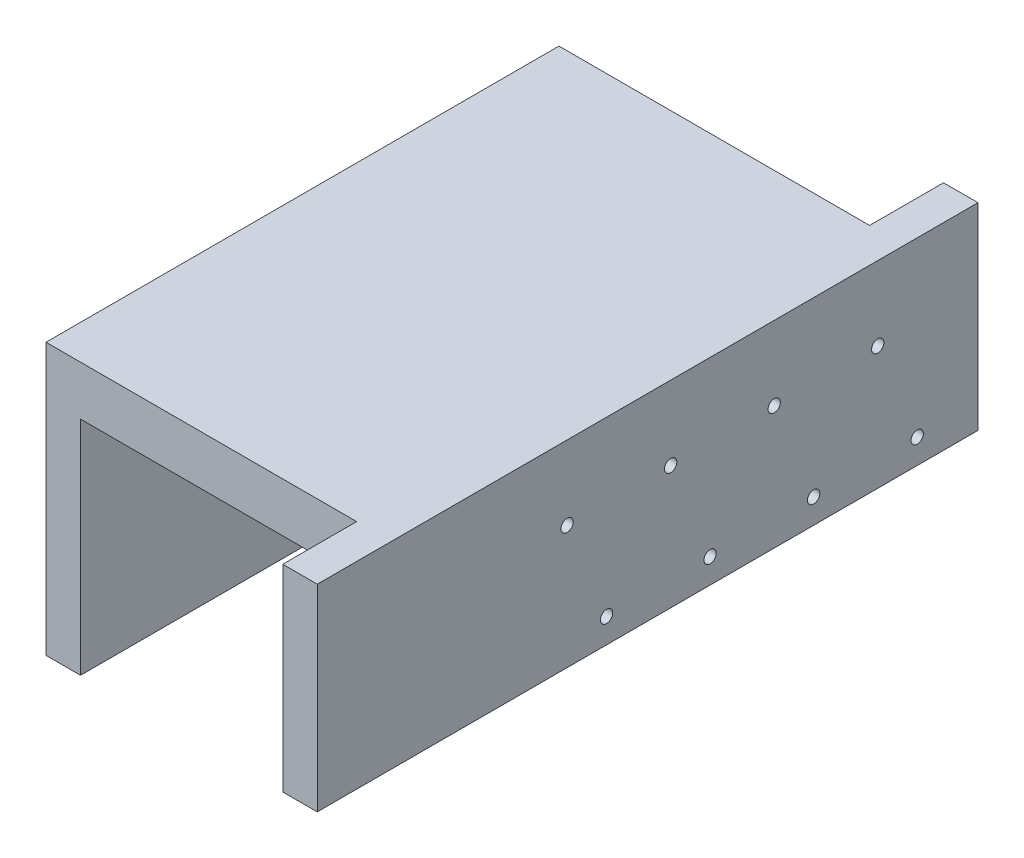
ISO-10303-21;
HEADER;
FILE_DESCRIPTION(('STEP AP214'),'2;1');
FILE_NAME('part.step','',(''),(''),'','','');
FILE_SCHEMA(('AUTOMOTIVE_DESIGN { 1 0 10303 214 1 1 1 1 }'));
ENDSEC;
DATA;
#1=APPLICATION_CONTEXT('core data for automotive mechanical design processes');
#2=APPLICATION_PROTOCOL_DEFINITION('international standard','automotive_design',2000,#1);
#3=PRODUCT_CONTEXT('',#1,'mechanical');
#4=PRODUCT('Part','Part','',(#3));
#5=PRODUCT_RELATED_PRODUCT_CATEGORY('part','',(#4));
#6=PRODUCT_DEFINITION_FORMATION('','',#4);
#7=PRODUCT_DEFINITION_CONTEXT('part definition',#1,'design');
#8=PRODUCT_DEFINITION('design','',#6,#7);
#9=PRODUCT_DEFINITION_SHAPE('','',#8);
#10=(LENGTH_UNIT() NAMED_UNIT(*) SI_UNIT(.MILLI.,.METRE.));
#11=(NAMED_UNIT(*) PLANE_ANGLE_UNIT() SI_UNIT($,.RADIAN.));
#12=(NAMED_UNIT(*) SI_UNIT($,.STERADIAN.) SOLID_ANGLE_UNIT());
#13=UNCERTAINTY_MEASURE_WITH_UNIT(LENGTH_MEASURE(1.E-05),#10,'distance_accuracy_value','');
#14=(GEOMETRIC_REPRESENTATION_CONTEXT(3) GLOBAL_UNCERTAINTY_ASSIGNED_CONTEXT((#13)) GLOBAL_UNIT_ASSIGNED_CONTEXT((#10,
#11,#12)) REPRESENTATION_CONTEXT('',''));
#15=CARTESIAN_POINT('',(0.,0.,0.));
#16=DIRECTION('',(0.,0.,1.));
#17=DIRECTION('',(1.,0.,0.));
#18=AXIS2_PLACEMENT_3D('',#15,#16,#17);
#19=CARTESIAN_POINT('',(0.,0.,134.));
#20=DIRECTION('',(1.,0.,0.));
#21=DIRECTION('',(0.,1.,0.));
#22=AXIS2_PLACEMENT_3D('',#19,#20,#21);
#23=PLANE('',#22);
#24=CARTESIAN_POINT('',(0.,14.0543736011543,80.6313170643723));
#25=DIRECTION('',(1.,0.,0.));
#26=DIRECTION('',(0.,1.,0.));
#27=AXIS2_PLACEMENT_3D('',#24,#25,#26);
#28=CIRCLE('',#27,1.69999999999999);
#29=CARTESIAN_POINT('',(0.,15.7543736011543,80.6313170643723));
#30=VERTEX_POINT('',#29);
#31=EDGE_CURVE('E46',#30,#30,#28,.T.);
#32=ORIENTED_EDGE('',*,*,#31,.T.);
#33=EDGE_LOOP('',(#32));
#34=FACE_BOUND('',#33,.T.);
#35=CARTESIAN_POINT('',(0.,39.4543736011543,80.6313170643723));
#36=DIRECTION('',(1.,0.,0.));
#37=DIRECTION('',(0.,1.,0.));
#38=AXIS2_PLACEMENT_3D('',#35,#36,#37);
#39=CIRCLE('',#38,1.69999999999999);
#40=CARTESIAN_POINT('',(0.,41.1543736011543,80.6313170643723));
#41=VERTEX_POINT('',#40);
#42=EDGE_CURVE('E257',#41,#41,#39,.T.);
#43=ORIENTED_EDGE('',*,*,#42,.T.);
#44=EDGE_LOOP('',(#43));
#45=FACE_BOUND('',#44,.T.);
#46=CARTESIAN_POINT('',(0.,14.0543736011543,52.6913170643723));
#47=DIRECTION('',(1.,0.,0.));
#48=DIRECTION('',(0.,1.,0.));
#49=AXIS2_PLACEMENT_3D('',#46,#47,#48);
#50=CIRCLE('',#49,1.69999999999999);
#51=CARTESIAN_POINT('',(0.,15.7543736011543,52.6913170643723));
#52=VERTEX_POINT('',#51);
#53=EDGE_CURVE('E253',#52,#52,#50,.T.);
#54=ORIENTED_EDGE('',*,*,#53,.T.);
#55=EDGE_LOOP('',(#54));
#56=FACE_BOUND('',#55,.T.);
#57=CARTESIAN_POINT('',(0.,39.4543736011543,52.6913170643723));
#58=DIRECTION('',(1.,0.,0.));
#59=DIRECTION('',(0.,1.,0.));
#60=AXIS2_PLACEMENT_3D('',#57,#58,#59);
#61=CIRCLE('',#60,1.69999999999999);
#62=CARTESIAN_POINT('',(0.,41.1543736011543,52.6913170643723));
#63=VERTEX_POINT('',#62);
#64=EDGE_CURVE('E157',#63,#63,#61,.T.);
#65=ORIENTED_EDGE('',*,*,#64,.T.);
#66=EDGE_LOOP('',(#65));
#67=FACE_BOUND('',#66,.T.);
#68=DIRECTION('',(0.,-1.,0.));
#69=VECTOR('',#68,1.);
#70=CARTESIAN_POINT('',(0.,0.,14.9857106713486));
#71=LINE('',#70,#69);
#72=CARTESIAN_POINT('',(0.,55.,14.9857106713486));
#73=VERTEX_POINT('',#72);
#74=CARTESIAN_POINT('',(0.,0.,14.9857106713486));
#75=VERTEX_POINT('',#74);
#76=EDGE_CURVE('E126',#73,#75,#71,.T.);
#77=ORIENTED_EDGE('',*,*,#76,.T.);
#78=DIRECTION('',(0.,0.,-1.));
#79=VECTOR('',#78,1.);
#80=CARTESIAN_POINT('',(0.,0.,134.));
#81=LINE('',#80,#79);
#82=CARTESIAN_POINT('',(0.,0.,119.014289328651));
#83=VERTEX_POINT('',#82);
#84=EDGE_CURVE('E11',#83,#75,#81,.T.);
#85=ORIENTED_EDGE('',*,*,#84,.F.);
#86=DIRECTION('',(0.,-1.,0.));
#87=VECTOR('',#86,1.);
#88=CARTESIAN_POINT('',(0.,0.,119.014289328651));
#89=LINE('',#88,#87);
#90=CARTESIAN_POINT('',(0.,55.,119.014289328651));
#91=VERTEX_POINT('',#90);
#92=EDGE_CURVE('E153',#91,#83,#89,.T.);
#93=ORIENTED_EDGE('',*,*,#92,.F.);
#94=DIRECTION('',(0.,0.,-1.));
#95=VECTOR('',#94,1.);
#96=CARTESIAN_POINT('',(0.,55.,134.));
#97=LINE('',#96,#95);
#98=EDGE_CURVE('E245',#91,#73,#97,.T.);
#99=ORIENTED_EDGE('',*,*,#98,.T.);
#100=EDGE_LOOP('',(#77,#85,#93,#99));
#101=FACE_BOUND('',#100,.T.);
#102=ADVANCED_FACE('F43',(#34,#45,#56,#67,#101),#23,.F.);
#103=CARTESIAN_POINT('',(0.,0.,134.));
#104=DIRECTION('',(0.,1.,0.));
#105=DIRECTION('',(0.,0.,1.));
#106=AXIS2_PLACEMENT_3D('',#103,#104,#105);
#107=PLANE('',#106);
#108=DIRECTION('',(-1.,0.,0.));
#109=VECTOR('',#108,1.);
#110=CARTESIAN_POINT('',(63.,0.,14.9857106713486));
#111=LINE('',#110,#109);
#112=CARTESIAN_POINT('',(6.99999999999997,0.,14.9857106713486));
#113=VERTEX_POINT('',#112);
#114=EDGE_CURVE('E131',#113,#75,#111,.T.);
#115=ORIENTED_EDGE('',*,*,#114,.F.);
#116=DIRECTION('',(0.,0.,1.));
#117=VECTOR('',#116,1.);
#118=CARTESIAN_POINT('',(6.99999999999997,0.,0.));
#119=LINE('',#118,#117);
#120=CARTESIAN_POINT('',(6.99999999999997,0.,119.014289328651));
#121=VERTEX_POINT('',#120);
#122=EDGE_CURVE('E223',#113,#121,#119,.T.);
#123=ORIENTED_EDGE('',*,*,#122,.T.);
#124=DIRECTION('',(-1.,0.,0.));
#125=VECTOR('',#124,1.);
#126=CARTESIAN_POINT('',(63.,0.,119.014289328651));
#127=LINE('',#126,#125);
#128=EDGE_CURVE('E148',#121,#83,#127,.T.);
#129=ORIENTED_EDGE('',*,*,#128,.T.);
#130=ORIENTED_EDGE('',*,*,#84,.T.);
#131=EDGE_LOOP('',(#115,#123,#129,#130));
#132=FACE_BOUND('',#131,.T.);
#133=ADVANCED_FACE('F305',(#132),#107,.F.);
#134=CARTESIAN_POINT('',(0.,55.,134.));
#135=DIRECTION('',(0.,-1.,0.));
#136=DIRECTION('',(0.,0.,-1.));
#137=AXIS2_PLACEMENT_3D('',#134,#135,#136);
#138=PLANE('',#137);
#139=DIRECTION('',(-1.,0.,0.));
#140=VECTOR('',#139,1.);
#141=CARTESIAN_POINT('',(63.,55.,14.9857106713486));
#142=LINE('',#141,#140);
#143=CARTESIAN_POINT('',(63.,55.,14.9857106713486));
#144=VERTEX_POINT('',#143);
#145=EDGE_CURVE('E120',#144,#73,#142,.T.);
#146=ORIENTED_EDGE('',*,*,#145,.T.);
#147=ORIENTED_EDGE('',*,*,#98,.F.);
#148=DIRECTION('',(-1.,0.,0.));
#149=VECTOR('',#148,1.);
#150=CARTESIAN_POINT('',(63.,55.,119.014289328651));
#151=LINE('',#150,#149);
#152=CARTESIAN_POINT('',(63.,55.,119.014289328651));
#153=VERTEX_POINT('',#152);
#154=EDGE_CURVE('E155',#153,#91,#151,.T.);
#155=ORIENTED_EDGE('',*,*,#154,.F.);
#156=DIRECTION('',(0.,0.,-1.));
#157=VECTOR('',#156,1.);
#158=CARTESIAN_POINT('',(63.,55.,0.));
#159=LINE('',#158,#157);
#160=CARTESIAN_POINT('',(63.,55.,134.));
#161=VERTEX_POINT('',#160);
#162=EDGE_CURVE('E151',#161,#153,#159,.T.);
#163=ORIENTED_EDGE('',*,*,#162,.F.);
#164=DIRECTION('',(-1.,0.,0.));
#165=VECTOR('',#164,1.);
#166=CARTESIAN_POINT('',(0.,55.,134.));
#167=LINE('',#166,#165);
#168=CARTESIAN_POINT('',(70.,55.,134.));
#169=VERTEX_POINT('',#168);
#170=EDGE_CURVE('E242',#169,#161,#167,.T.);
#171=ORIENTED_EDGE('',*,*,#170,.F.);
#172=DIRECTION('',(0.,0.,-1.));
#173=VECTOR('',#172,1.);
#174=CARTESIAN_POINT('',(70.,55.,134.));
#175=LINE('',#174,#173);
#176=CARTESIAN_POINT('',(70.,55.,0.));
#177=VERTEX_POINT('',#176);
#178=EDGE_CURVE('E51',#169,#177,#175,.T.);
#179=ORIENTED_EDGE('',*,*,#178,.T.);
#180=DIRECTION('',(-1.,0.,0.));
#181=VECTOR('',#180,1.);
#182=CARTESIAN_POINT('',(0.,55.,0.));
#183=LINE('',#182,#181);
#184=CARTESIAN_POINT('',(63.,55.,0.));
#185=VERTEX_POINT('',#184);
#186=EDGE_CURVE('E143',#177,#185,#183,.T.);
#187=ORIENTED_EDGE('',*,*,#186,.T.);
#188=DIRECTION('',(0.,0.,-1.));
#189=VECTOR('',#188,1.);
#190=CARTESIAN_POINT('',(63.,55.,0.));
#191=LINE('',#190,#189);
#192=EDGE_CURVE('E132',#144,#185,#191,.T.);
#193=ORIENTED_EDGE('',*,*,#192,.F.);
#194=EDGE_LOOP('',(#146,#147,#155,#163,#171,#179,#187,#193));
#195=FACE_BOUND('',#194,.T.);
#196=ADVANCED_FACE('F140',(#195),#138,.F.);
#197=CARTESIAN_POINT('',(0.,0.,134.));
#198=DIRECTION('',(0.,0.,-1.));
#199=DIRECTION('',(-1.,0.,0.));
#200=AXIS2_PLACEMENT_3D('',#197,#198,#199);
#201=PLANE('',#200);
#202=ORIENTED_EDGE('',*,*,#170,.T.);
#203=DIRECTION('',(0.,-1.,0.));
#204=VECTOR('',#203,1.);
#205=CARTESIAN_POINT('',(63.,0.,134.));
#206=LINE('',#205,#204);
#207=CARTESIAN_POINT('',(63.,15.,134.));
#208=VERTEX_POINT('',#207);
#209=EDGE_CURVE('E236',#161,#208,#206,.T.);
#210=ORIENTED_EDGE('',*,*,#209,.T.);
#211=DIRECTION('',(1.,0.,0.));
#212=VECTOR('',#211,1.);
#213=CARTESIAN_POINT('',(0.,15.,134.));
#214=LINE('',#213,#212);
#215=CARTESIAN_POINT('',(70.,15.,134.));
#216=VERTEX_POINT('',#215);
#217=EDGE_CURVE('E226',#208,#216,#214,.T.);
#218=ORIENTED_EDGE('',*,*,#217,.T.);
#219=DIRECTION('',(0.,1.,0.));
#220=VECTOR('',#219,1.);
#221=CARTESIAN_POINT('',(70.,0.,134.));
#222=LINE('',#221,#220);
#223=EDGE_CURVE('E240',#216,#169,#222,.T.);
#224=ORIENTED_EDGE('',*,*,#223,.T.);
#225=EDGE_LOOP('',(#202,#210,#218,#224));
#226=FACE_BOUND('',#225,.T.);
#227=ADVANCED_FACE('F313',(#226),#201,.F.);
#228=CARTESIAN_POINT('',(0.,0.,0.));
#229=DIRECTION('',(0.,0.,-1.));
#230=DIRECTION('',(-1.,0.,0.));
#231=AXIS2_PLACEMENT_3D('',#228,#229,#230);
#232=PLANE('',#231);
#233=DIRECTION('',(0.,1.,0.));
#234=VECTOR('',#233,1.);
#235=CARTESIAN_POINT('',(63.,45.,0.));
#236=LINE('',#235,#234);
#237=CARTESIAN_POINT('',(63.,15.,0.));
#238=VERTEX_POINT('',#237);
#239=EDGE_CURVE('E66',#238,#185,#236,.T.);
#240=ORIENTED_EDGE('',*,*,#239,.T.);
#241=ORIENTED_EDGE('',*,*,#186,.F.);
#242=DIRECTION('',(0.,1.,0.));
#243=VECTOR('',#242,1.);
#244=CARTESIAN_POINT('',(70.,0.,0.));
#245=LINE('',#244,#243);
#246=CARTESIAN_POINT('',(70.,15.,0.));
#247=VERTEX_POINT('',#246);
#248=EDGE_CURVE('E239',#247,#177,#245,.T.);
#249=ORIENTED_EDGE('',*,*,#248,.F.);
#250=DIRECTION('',(-1.,0.,0.));
#251=VECTOR('',#250,1.);
#252=CARTESIAN_POINT('',(63.,15.,0.));
#253=LINE('',#252,#251);
#254=EDGE_CURVE('E178',#247,#238,#253,.T.);
#255=ORIENTED_EDGE('',*,*,#254,.T.);
#256=EDGE_LOOP('',(#240,#241,#249,#255));
#257=FACE_BOUND('',#256,.T.);
#258=ADVANCED_FACE('F294',(#257),#232,.T.);
#259=CARTESIAN_POINT('',(6.99999999999997,0.,0.));
#260=DIRECTION('',(-1.,0.,0.));
#261=DIRECTION('',(0.,0.,1.));
#262=AXIS2_PLACEMENT_3D('',#259,#260,#261);
#263=PLANE('',#262);
#264=CARTESIAN_POINT('',(6.99999999999997,14.0543736011543,80.6313170643723));
#265=DIRECTION('',(1.,0.,0.));
#266=DIRECTION('',(0.,0.,-1.));
#267=AXIS2_PLACEMENT_3D('',#264,#265,#266);
#268=CIRCLE('',#267,3.15);
#269=CARTESIAN_POINT('',(6.99999999999997,14.0543736011543,77.4813170643723));
#270=VERTEX_POINT('',#269);
#271=EDGE_CURVE('E574',#270,#270,#268,.T.);
#272=ORIENTED_EDGE('',*,*,#271,.F.);
#273=EDGE_LOOP('',(#272));
#274=FACE_BOUND('',#273,.T.);
#275=CARTESIAN_POINT('',(6.99999999999997,39.4543736011543,80.6313170643723));
#276=DIRECTION('',(1.,0.,0.));
#277=DIRECTION('',(0.,0.,-1.));
#278=AXIS2_PLACEMENT_3D('',#275,#276,#277);
#279=CIRCLE('',#278,3.15);
#280=CARTESIAN_POINT('',(6.99999999999997,39.4543736011543,77.4813170643723));
#281=VERTEX_POINT('',#280);
#282=EDGE_CURVE('E266',#281,#281,#279,.T.);
#283=ORIENTED_EDGE('',*,*,#282,.F.);
#284=EDGE_LOOP('',(#283));
#285=FACE_BOUND('',#284,.T.);
#286=CARTESIAN_POINT('',(6.99999999999997,14.0543736011543,52.6913170643723));
#287=DIRECTION('',(1.,0.,0.));
#288=DIRECTION('',(0.,0.,-1.));
#289=AXIS2_PLACEMENT_3D('',#286,#287,#288);
#290=CIRCLE('',#289,3.15);
#291=CARTESIAN_POINT('',(6.99999999999997,14.0543736011543,49.5413170643723));
#292=VERTEX_POINT('',#291);
#293=EDGE_CURVE('E259',#292,#292,#290,.T.);
#294=ORIENTED_EDGE('',*,*,#293,.F.);
#295=EDGE_LOOP('',(#294));
#296=FACE_BOUND('',#295,.T.);
#297=CARTESIAN_POINT('',(6.99999999999997,39.4543736011543,52.6913170643723));
#298=DIRECTION('',(1.,0.,0.));
#299=DIRECTION('',(0.,0.,-1.));
#300=AXIS2_PLACEMENT_3D('',#297,#298,#299);
#301=CIRCLE('',#300,3.15);
#302=CARTESIAN_POINT('',(6.99999999999997,39.4543736011543,49.5413170643723));
#303=VERTEX_POINT('',#302);
#304=EDGE_CURVE('E255',#303,#303,#301,.T.);
#305=ORIENTED_EDGE('',*,*,#304,.F.);
#306=EDGE_LOOP('',(#305));
#307=FACE_BOUND('',#306,.T.);
#308=DIRECTION('',(0.,-1.,0.));
#309=VECTOR('',#308,1.);
#310=CARTESIAN_POINT('',(6.99999999999997,0.,14.9857106713486));
#311=LINE('',#310,#309);
#312=CARTESIAN_POINT('',(6.99999999999997,45.,14.9857106713486));
#313=VERTEX_POINT('',#312);
#314=EDGE_CURVE('E168',#313,#113,#311,.T.);
#315=ORIENTED_EDGE('',*,*,#314,.F.);
#316=DIRECTION('',(0.,0.,1.));
#317=VECTOR('',#316,1.);
#318=CARTESIAN_POINT('',(6.99999999999997,45.,0.));
#319=LINE('',#318,#317);
#320=CARTESIAN_POINT('',(6.99999999999997,45.,119.014289328651));
#321=VERTEX_POINT('',#320);
#322=EDGE_CURVE('E227',#313,#321,#319,.T.);
#323=ORIENTED_EDGE('',*,*,#322,.T.);
#324=DIRECTION('',(0.,-1.,0.));
#325=VECTOR('',#324,1.);
#326=CARTESIAN_POINT('',(6.99999999999997,0.,119.014289328651));
#327=LINE('',#326,#325);
#328=EDGE_CURVE('E163',#321,#121,#327,.T.);
#329=ORIENTED_EDGE('',*,*,#328,.T.);
#330=ORIENTED_EDGE('',*,*,#122,.F.);
#331=EDGE_LOOP('',(#315,#323,#329,#330));
#332=FACE_BOUND('',#331,.T.);
#333=ADVANCED_FACE('F290',(#274,#285,#296,#307,#332),#263,.F.);
#334=CARTESIAN_POINT('',(6.99999999999997,45.,0.));
#335=DIRECTION('',(0.,1.,0.));
#336=DIRECTION('',(0.,0.,1.));
#337=AXIS2_PLACEMENT_3D('',#334,#335,#336);
#338=PLANE('',#337);
#339=DIRECTION('',(-1.,0.,0.));
#340=VECTOR('',#339,1.);
#341=CARTESIAN_POINT('',(6.99999999999997,45.,14.9857106713486));
#342=LINE('',#341,#340);
#343=CARTESIAN_POINT('',(63.,45.,14.9857106713486));
#344=VERTEX_POINT('',#343);
#345=EDGE_CURVE('E166',#344,#313,#342,.T.);
#346=ORIENTED_EDGE('',*,*,#345,.F.);
#347=DIRECTION('',(0.,0.,1.));
#348=VECTOR('',#347,1.);
#349=CARTESIAN_POINT('',(63.,45.,0.));
#350=LINE('',#349,#348);
#351=CARTESIAN_POINT('',(63.,45.,119.014289328651));
#352=VERTEX_POINT('',#351);
#353=EDGE_CURVE('E138',#344,#352,#350,.T.);
#354=ORIENTED_EDGE('',*,*,#353,.T.);
#355=DIRECTION('',(-1.,0.,0.));
#356=VECTOR('',#355,1.);
#357=CARTESIAN_POINT('',(6.99999999999997,45.,119.014289328651));
#358=LINE('',#357,#356);
#359=EDGE_CURVE('E149',#352,#321,#358,.T.);
#360=ORIENTED_EDGE('',*,*,#359,.T.);
#361=ORIENTED_EDGE('',*,*,#322,.F.);
#362=EDGE_LOOP('',(#346,#354,#360,#361));
#363=FACE_BOUND('',#362,.T.);
#364=ADVANCED_FACE('F293',(#363),#338,.F.);
#365=CARTESIAN_POINT('',(70.,0.,134.));
#366=DIRECTION('',(-1.,0.,0.));
#367=DIRECTION('',(0.,-1.,0.));
#368=AXIS2_PLACEMENT_3D('',#365,#366,#367);
#369=PLANE('',#368);
#370=CARTESIAN_POINT('',(70.,40.,83.3317645611481));
#371=DIRECTION('',(1.,0.,0.));
#372=DIRECTION('',(0.,1.,0.));
#373=AXIS2_PLACEMENT_3D('',#370,#371,#372);
#374=CIRCLE('',#373,1.25);
#375=CARTESIAN_POINT('',(70.,41.25,83.3317645611481));
#376=VERTEX_POINT('',#375);
#377=EDGE_CURVE('E171',#376,#376,#374,.T.);
#378=ORIENTED_EDGE('',*,*,#377,.F.);
#379=EDGE_LOOP('',(#378));
#380=FACE_BOUND('',#379,.T.);
#381=CARTESIAN_POINT('',(70.,20.,75.3317645611481));
#382=DIRECTION('',(1.,0.,0.));
#383=DIRECTION('',(0.,1.,0.));
#384=AXIS2_PLACEMENT_3D('',#381,#382,#383);
#385=CIRCLE('',#384,1.25);
#386=CARTESIAN_POINT('',(70.,21.25,75.3317645611481));
#387=VERTEX_POINT('',#386);
#388=EDGE_CURVE('E175',#387,#387,#385,.T.);
#389=ORIENTED_EDGE('',*,*,#388,.F.);
#390=EDGE_LOOP('',(#389));
#391=FACE_BOUND('',#390,.T.);
#392=CARTESIAN_POINT('',(70.,40.,62.3317645611481));
#393=DIRECTION('',(1.,0.,0.));
#394=DIRECTION('',(0.,1.,0.));
#395=AXIS2_PLACEMENT_3D('',#392,#393,#394);
#396=CIRCLE('',#395,1.25);
#397=CARTESIAN_POINT('',(70.,41.25,62.3317645611481));
#398=VERTEX_POINT('',#397);
#399=EDGE_CURVE('E182',#398,#398,#396,.T.);
#400=ORIENTED_EDGE('',*,*,#399,.F.);
#401=EDGE_LOOP('',(#400));
#402=FACE_BOUND('',#401,.T.);
#403=CARTESIAN_POINT('',(70.,20.,54.3317645611481));
#404=DIRECTION('',(1.,0.,0.));
#405=DIRECTION('',(0.,1.,0.));
#406=AXIS2_PLACEMENT_3D('',#403,#404,#405);
#407=CIRCLE('',#406,1.25000000000001);
#408=CARTESIAN_POINT('',(70.,21.25,54.3317645611481));
#409=VERTEX_POINT('',#408);
#410=EDGE_CURVE('E188',#409,#409,#407,.T.);
#411=ORIENTED_EDGE('',*,*,#410,.F.);
#412=EDGE_LOOP('',(#411));
#413=FACE_BOUND('',#412,.T.);
#414=CARTESIAN_POINT('',(70.,40.,41.3317645611481));
#415=DIRECTION('',(1.,0.,0.));
#416=DIRECTION('',(0.,1.,0.));
#417=AXIS2_PLACEMENT_3D('',#414,#415,#416);
#418=CIRCLE('',#417,1.25);
#419=CARTESIAN_POINT('',(70.,41.25,41.3317645611481));
#420=VERTEX_POINT('',#419);
#421=EDGE_CURVE('E194',#420,#420,#418,.T.);
#422=ORIENTED_EDGE('',*,*,#421,.F.);
#423=EDGE_LOOP('',(#422));
#424=FACE_BOUND('',#423,.T.);
#425=CARTESIAN_POINT('',(70.,20.,33.3317645611481));
#426=DIRECTION('',(1.,0.,0.));
#427=DIRECTION('',(0.,1.,0.));
#428=AXIS2_PLACEMENT_3D('',#425,#426,#427);
#429=CIRCLE('',#428,1.25000000000001);
#430=CARTESIAN_POINT('',(70.,21.25,33.3317645611481));
#431=VERTEX_POINT('',#430);
#432=EDGE_CURVE('E200',#431,#431,#429,.T.);
#433=ORIENTED_EDGE('',*,*,#432,.F.);
#434=EDGE_LOOP('',(#433));
#435=FACE_BOUND('',#434,.T.);
#436=CARTESIAN_POINT('',(70.,40.,20.3317645611481));
#437=DIRECTION('',(1.,0.,0.));
#438=DIRECTION('',(0.,1.,0.));
#439=AXIS2_PLACEMENT_3D('',#436,#437,#438);
#440=CIRCLE('',#439,1.25);
#441=CARTESIAN_POINT('',(70.,41.25,20.3317645611481));
#442=VERTEX_POINT('',#441);
#443=EDGE_CURVE('E206',#442,#442,#440,.T.);
#444=ORIENTED_EDGE('',*,*,#443,.F.);
#445=EDGE_LOOP('',(#444));
#446=FACE_BOUND('',#445,.T.);
#447=CARTESIAN_POINT('',(70.,20.,12.3317645611481));
#448=DIRECTION('',(1.,0.,0.));
#449=DIRECTION('',(0.,1.,0.));
#450=AXIS2_PLACEMENT_3D('',#447,#448,#449);
#451=CIRCLE('',#450,1.25000000000001);
#452=CARTESIAN_POINT('',(70.,21.25,12.3317645611481));
#453=VERTEX_POINT('',#452);
#454=EDGE_CURVE('E212',#453,#453,#451,.T.);
#455=ORIENTED_EDGE('',*,*,#454,.F.);
#456=EDGE_LOOP('',(#455));
#457=FACE_BOUND('',#456,.T.);
#458=ORIENTED_EDGE('',*,*,#223,.F.);
#459=DIRECTION('',(0.,0.,1.));
#460=VECTOR('',#459,1.);
#461=CARTESIAN_POINT('',(70.,15.,0.));
#462=LINE('',#461,#460);
#463=EDGE_CURVE('E222',#247,#216,#462,.T.);
#464=ORIENTED_EDGE('',*,*,#463,.F.);
#465=ORIENTED_EDGE('',*,*,#248,.T.);
#466=ORIENTED_EDGE('',*,*,#178,.F.);
#467=EDGE_LOOP('',(#458,#464,#465,#466));
#468=FACE_BOUND('',#467,.T.);
#469=ADVANCED_FACE('F319',(#380,#391,#402,#413,#424,#435,#446,#457,#468),#369,.F.);
#470=CARTESIAN_POINT('',(63.,45.,0.));
#471=DIRECTION('',(1.,0.,0.));
#472=DIRECTION('',(0.,0.,-1.));
#473=AXIS2_PLACEMENT_3D('',#470,#471,#472);
#474=PLANE('',#473);
#475=CARTESIAN_POINT('',(63.,20.,12.3317645611481));
#476=DIRECTION('',(1.,0.,0.));
#477=DIRECTION('',(0.,0.,-1.));
#478=AXIS2_PLACEMENT_3D('',#475,#476,#477);
#479=CIRCLE('',#478,1.25000000000001);
#480=CARTESIAN_POINT('',(63.,20.,11.0817645611481));
#481=VERTEX_POINT('',#480);
#482=EDGE_CURVE('E170',#481,#481,#479,.F.);
#483=ORIENTED_EDGE('',*,*,#482,.F.);
#484=EDGE_LOOP('',(#483));
#485=FACE_BOUND('',#484,.T.);
#486=DIRECTION('',(0.,0.,1.));
#487=VECTOR('',#486,1.);
#488=CARTESIAN_POINT('',(63.,15.,0.));
#489=LINE('',#488,#487);
#490=EDGE_CURVE('E231',#238,#208,#489,.T.);
#491=ORIENTED_EDGE('',*,*,#490,.T.);
#492=ORIENTED_EDGE('',*,*,#209,.F.);
#493=ORIENTED_EDGE('',*,*,#162,.T.);
#494=DIRECTION('',(0.,-1.,0.));
#495=VECTOR('',#494,1.);
#496=CARTESIAN_POINT('',(63.,0.,119.014289328651));
#497=LINE('',#496,#495);
#498=EDGE_CURVE('E59',#153,#352,#497,.T.);
#499=ORIENTED_EDGE('',*,*,#498,.T.);
#500=ORIENTED_EDGE('',*,*,#353,.F.);
#501=DIRECTION('',(0.,-1.,0.));
#502=VECTOR('',#501,1.);
#503=CARTESIAN_POINT('',(63.,0.,14.9857106713486));
#504=LINE('',#503,#502);
#505=EDGE_CURVE('E123',#144,#344,#504,.T.);
#506=ORIENTED_EDGE('',*,*,#505,.F.);
#507=ORIENTED_EDGE('',*,*,#192,.T.);
#508=ORIENTED_EDGE('',*,*,#239,.F.);
#509=EDGE_LOOP('',(#491,#492,#493,#499,#500,#506,#507,#508));
#510=FACE_BOUND('',#509,.T.);
#511=CARTESIAN_POINT('',(63.,40.,20.3317645611481));
#512=DIRECTION('',(1.,0.,0.));
#513=DIRECTION('',(0.,0.,-1.));
#514=AXIS2_PLACEMENT_3D('',#511,#512,#513);
#515=CIRCLE('',#514,1.25);
#516=CARTESIAN_POINT('',(63.,40.,19.0817645611481));
#517=VERTEX_POINT('',#516);
#518=EDGE_CURVE('E209',#517,#517,#515,.F.);
#519=ORIENTED_EDGE('',*,*,#518,.F.);
#520=EDGE_LOOP('',(#519));
#521=FACE_BOUND('',#520,.T.);
#522=CARTESIAN_POINT('',(63.,20.,33.3317645611481));
#523=DIRECTION('',(1.,0.,0.));
#524=DIRECTION('',(0.,0.,-1.));
#525=AXIS2_PLACEMENT_3D('',#522,#523,#524);
#526=CIRCLE('',#525,1.25000000000001);
#527=CARTESIAN_POINT('',(63.,20.,32.0817645611481));
#528=VERTEX_POINT('',#527);
#529=EDGE_CURVE('E203',#528,#528,#526,.F.);
#530=ORIENTED_EDGE('',*,*,#529,.F.);
#531=EDGE_LOOP('',(#530));
#532=FACE_BOUND('',#531,.T.);
#533=CARTESIAN_POINT('',(63.,40.,41.3317645611481));
#534=DIRECTION('',(1.,0.,0.));
#535=DIRECTION('',(0.,0.,-1.));
#536=AXIS2_PLACEMENT_3D('',#533,#534,#535);
#537=CIRCLE('',#536,1.25);
#538=CARTESIAN_POINT('',(63.,40.,40.0817645611481));
#539=VERTEX_POINT('',#538);
#540=EDGE_CURVE('E197',#539,#539,#537,.F.);
#541=ORIENTED_EDGE('',*,*,#540,.F.);
#542=EDGE_LOOP('',(#541));
#543=FACE_BOUND('',#542,.T.);
#544=CARTESIAN_POINT('',(63.,20.,54.3317645611481));
#545=DIRECTION('',(1.,0.,0.));
#546=DIRECTION('',(0.,0.,-1.));
#547=AXIS2_PLACEMENT_3D('',#544,#545,#546);
#548=CIRCLE('',#547,1.25000000000001);
#549=CARTESIAN_POINT('',(63.,20.,53.0817645611481));
#550=VERTEX_POINT('',#549);
#551=EDGE_CURVE('E191',#550,#550,#548,.F.);
#552=ORIENTED_EDGE('',*,*,#551,.F.);
#553=EDGE_LOOP('',(#552));
#554=FACE_BOUND('',#553,.T.);
#555=CARTESIAN_POINT('',(63.,40.,62.3317645611481));
#556=DIRECTION('',(1.,0.,0.));
#557=DIRECTION('',(0.,0.,-1.));
#558=AXIS2_PLACEMENT_3D('',#555,#556,#557);
#559=CIRCLE('',#558,1.25);
#560=CARTESIAN_POINT('',(63.,40.,61.0817645611481));
#561=VERTEX_POINT('',#560);
#562=EDGE_CURVE('E185',#561,#561,#559,.F.);
#563=ORIENTED_EDGE('',*,*,#562,.F.);
#564=EDGE_LOOP('',(#563));
#565=FACE_BOUND('',#564,.T.);
#566=CARTESIAN_POINT('',(63.,20.,75.3317645611481));
#567=DIRECTION('',(1.,0.,0.));
#568=DIRECTION('',(0.,0.,-1.));
#569=AXIS2_PLACEMENT_3D('',#566,#567,#568);
#570=CIRCLE('',#569,1.25);
#571=CARTESIAN_POINT('',(63.,20.,74.0817645611481));
#572=VERTEX_POINT('',#571);
#573=EDGE_CURVE('E179',#572,#572,#570,.F.);
#574=ORIENTED_EDGE('',*,*,#573,.F.);
#575=EDGE_LOOP('',(#574));
#576=FACE_BOUND('',#575,.T.);
#577=CARTESIAN_POINT('',(63.,40.,83.3317645611481));
#578=DIRECTION('',(1.,0.,0.));
#579=DIRECTION('',(0.,0.,-1.));
#580=AXIS2_PLACEMENT_3D('',#577,#578,#579);
#581=CIRCLE('',#580,1.25);
#582=CARTESIAN_POINT('',(63.,40.,82.0817645611481));
#583=VERTEX_POINT('',#582);
#584=EDGE_CURVE('E174',#583,#583,#581,.F.);
#585=ORIENTED_EDGE('',*,*,#584,.F.);
#586=EDGE_LOOP('',(#585));
#587=FACE_BOUND('',#586,.T.);
#588=ADVANCED_FACE('F134',(#485,#510,#521,#532,#543,#554,#565,#576,#587),#474,.F.);
#589=CARTESIAN_POINT('',(63.,15.,0.));
#590=DIRECTION('',(0.,1.,0.));
#591=DIRECTION('',(0.,0.,1.));
#592=AXIS2_PLACEMENT_3D('',#589,#590,#591);
#593=PLANE('',#592);
#594=ORIENTED_EDGE('',*,*,#490,.F.);
#595=ORIENTED_EDGE('',*,*,#254,.F.);
#596=ORIENTED_EDGE('',*,*,#463,.T.);
#597=ORIENTED_EDGE('',*,*,#217,.F.);
#598=EDGE_LOOP('',(#594,#595,#596,#597));
#599=FACE_BOUND('',#598,.T.);
#600=ADVANCED_FACE('F323',(#599),#593,.F.);
#601=CARTESIAN_POINT('',(59.4644660940672,20.,12.3317645611481));
#602=DIRECTION('',(1.,0.,0.));
#603=DIRECTION('',(0.,1.,0.));
#604=AXIS2_PLACEMENT_3D('',#601,#602,#603);
#605=CYLINDRICAL_SURFACE('',#604,1.25000000000001);
#606=ORIENTED_EDGE('',*,*,#482,.T.);
#607=EDGE_LOOP('',(#606));
#608=FACE_BOUND('',#607,.T.);
#609=ORIENTED_EDGE('',*,*,#454,.T.);
#610=EDGE_LOOP('',(#609));
#611=FACE_BOUND('',#610,.T.);
#612=ADVANCED_FACE('F325',(#608,#611),#605,.F.);
#613=CARTESIAN_POINT('',(59.4644660940672,40.,20.3317645611481));
#614=DIRECTION('',(1.,0.,0.));
#615=DIRECTION('',(0.,1.,0.));
#616=AXIS2_PLACEMENT_3D('',#613,#614,#615);
#617=CYLINDRICAL_SURFACE('',#616,1.25);
#618=ORIENTED_EDGE('',*,*,#518,.T.);
#619=EDGE_LOOP('',(#618));
#620=FACE_BOUND('',#619,.T.);
#621=ORIENTED_EDGE('',*,*,#443,.T.);
#622=EDGE_LOOP('',(#621));
#623=FACE_BOUND('',#622,.T.);
#624=ADVANCED_FACE('F332',(#620,#623),#617,.F.);
#625=CARTESIAN_POINT('',(59.4644660940672,20.,33.3317645611481));
#626=DIRECTION('',(1.,0.,0.));
#627=DIRECTION('',(0.,1.,0.));
#628=AXIS2_PLACEMENT_3D('',#625,#626,#627);
#629=CYLINDRICAL_SURFACE('',#628,1.25000000000001);
#630=ORIENTED_EDGE('',*,*,#529,.T.);
#631=EDGE_LOOP('',(#630));
#632=FACE_BOUND('',#631,.T.);
#633=ORIENTED_EDGE('',*,*,#432,.T.);
#634=EDGE_LOOP('',(#633));
#635=FACE_BOUND('',#634,.T.);
#636=ADVANCED_FACE('F377',(#632,#635),#629,.F.);
#637=CARTESIAN_POINT('',(59.4644660940672,40.,41.3317645611481));
#638=DIRECTION('',(1.,0.,0.));
#639=DIRECTION('',(0.,1.,0.));
#640=AXIS2_PLACEMENT_3D('',#637,#638,#639);
#641=CYLINDRICAL_SURFACE('',#640,1.25);
#642=ORIENTED_EDGE('',*,*,#540,.T.);
#643=EDGE_LOOP('',(#642));
#644=FACE_BOUND('',#643,.T.);
#645=ORIENTED_EDGE('',*,*,#421,.T.);
#646=EDGE_LOOP('',(#645));
#647=FACE_BOUND('',#646,.T.);
#648=ADVANCED_FACE('F373',(#644,#647),#641,.F.);
#649=CARTESIAN_POINT('',(59.4644660940672,20.,54.3317645611481));
#650=DIRECTION('',(1.,0.,0.));
#651=DIRECTION('',(0.,1.,0.));
#652=AXIS2_PLACEMENT_3D('',#649,#650,#651);
#653=CYLINDRICAL_SURFACE('',#652,1.25000000000001);
#654=ORIENTED_EDGE('',*,*,#551,.T.);
#655=EDGE_LOOP('',(#654));
#656=FACE_BOUND('',#655,.T.);
#657=ORIENTED_EDGE('',*,*,#410,.T.);
#658=EDGE_LOOP('',(#657));
#659=FACE_BOUND('',#658,.T.);
#660=ADVANCED_FACE('F369',(#656,#659),#653,.F.);
#661=CARTESIAN_POINT('',(59.4644660940672,40.,62.3317645611481));
#662=DIRECTION('',(1.,0.,0.));
#663=DIRECTION('',(0.,1.,0.));
#664=AXIS2_PLACEMENT_3D('',#661,#662,#663);
#665=CYLINDRICAL_SURFACE('',#664,1.25);
#666=ORIENTED_EDGE('',*,*,#562,.T.);
#667=EDGE_LOOP('',(#666));
#668=FACE_BOUND('',#667,.T.);
#669=ORIENTED_EDGE('',*,*,#399,.T.);
#670=EDGE_LOOP('',(#669));
#671=FACE_BOUND('',#670,.T.);
#672=ADVANCED_FACE('F365',(#668,#671),#665,.F.);
#673=CARTESIAN_POINT('',(59.4644660940672,20.,75.3317645611481));
#674=DIRECTION('',(1.,0.,0.));
#675=DIRECTION('',(0.,1.,0.));
#676=AXIS2_PLACEMENT_3D('',#673,#674,#675);
#677=CYLINDRICAL_SURFACE('',#676,1.25);
#678=ORIENTED_EDGE('',*,*,#573,.T.);
#679=EDGE_LOOP('',(#678));
#680=FACE_BOUND('',#679,.T.);
#681=ORIENTED_EDGE('',*,*,#388,.T.);
#682=EDGE_LOOP('',(#681));
#683=FACE_BOUND('',#682,.T.);
#684=ADVANCED_FACE('F361',(#680,#683),#677,.F.);
#685=CARTESIAN_POINT('',(59.4644660940672,40.,83.3317645611481));
#686=DIRECTION('',(1.,0.,0.));
#687=DIRECTION('',(0.,1.,0.));
#688=AXIS2_PLACEMENT_3D('',#685,#686,#687);
#689=CYLINDRICAL_SURFACE('',#688,1.25);
#690=ORIENTED_EDGE('',*,*,#584,.T.);
#691=EDGE_LOOP('',(#690));
#692=FACE_BOUND('',#691,.T.);
#693=ORIENTED_EDGE('',*,*,#377,.T.);
#694=EDGE_LOOP('',(#693));
#695=FACE_BOUND('',#694,.T.);
#696=ADVANCED_FACE('F358',(#692,#695),#689,.F.);
#697=CARTESIAN_POINT('',(63.,0.,119.014289328651));
#698=DIRECTION('',(0.,0.,-1.));
#699=DIRECTION('',(-1.,0.,0.));
#700=AXIS2_PLACEMENT_3D('',#697,#698,#699);
#701=PLANE('',#700);
#702=ORIENTED_EDGE('',*,*,#359,.F.);
#703=ORIENTED_EDGE('',*,*,#498,.F.);
#704=ORIENTED_EDGE('',*,*,#154,.T.);
#705=ORIENTED_EDGE('',*,*,#92,.T.);
#706=ORIENTED_EDGE('',*,*,#128,.F.);
#707=ORIENTED_EDGE('',*,*,#328,.F.);
#708=EDGE_LOOP('',(#702,#703,#704,#705,#706,#707));
#709=FACE_BOUND('',#708,.T.);
#710=ADVANCED_FACE('F303',(#709),#701,.F.);
#711=CARTESIAN_POINT('',(63.,0.,14.9857106713486));
#712=DIRECTION('',(0.,0.,-1.));
#713=DIRECTION('',(-1.,0.,0.));
#714=AXIS2_PLACEMENT_3D('',#711,#712,#713);
#715=PLANE('',#714);
#716=ORIENTED_EDGE('',*,*,#314,.T.);
#717=ORIENTED_EDGE('',*,*,#114,.T.);
#718=ORIENTED_EDGE('',*,*,#76,.F.);
#719=ORIENTED_EDGE('',*,*,#145,.F.);
#720=ORIENTED_EDGE('',*,*,#505,.T.);
#721=ORIENTED_EDGE('',*,*,#345,.T.);
#722=EDGE_LOOP('',(#716,#717,#718,#719,#720,#721));
#723=FACE_BOUND('',#722,.T.);
#724=ADVANCED_FACE('F122',(#723),#715,.T.);
#725=CARTESIAN_POINT('',(6.99999999999997,39.4543736011543,52.6913170643723));
#726=DIRECTION('',(1.,0.,0.));
#727=DIRECTION('',(0.,0.,-1.));
#728=AXIS2_PLACEMENT_3D('',#725,#726,#727);
#729=CYLINDRICAL_SURFACE('',#728,1.69999999999999);
#730=CARTESIAN_POINT('',(5.54999999999997,39.4543736011543,52.6913170643723));
#731=DIRECTION('',(1.,0.,0.));
#732=DIRECTION('',(0.,0.,-1.));
#733=AXIS2_PLACEMENT_3D('',#730,#731,#732);
#734=CIRCLE('',#733,1.69999999999999);
#735=CARTESIAN_POINT('',(5.54999999999997,39.4543736011543,50.9913170643723));
#736=VERTEX_POINT('',#735);
#737=EDGE_CURVE('E252',#736,#736,#734,.T.);
#738=ORIENTED_EDGE('',*,*,#737,.T.);
#739=EDGE_LOOP('',(#738));
#740=FACE_BOUND('',#739,.T.);
#741=ORIENTED_EDGE('',*,*,#64,.F.);
#742=EDGE_LOOP('',(#741));
#743=FACE_BOUND('',#742,.T.);
#744=ADVANCED_FACE('F280',(#740,#743),#729,.F.);
#745=CARTESIAN_POINT('',(6.99999999999997,39.4543736011543,52.6913170643723));
#746=DIRECTION('',(1.,0.,0.));
#747=DIRECTION('',(0.,0.,-1.));
#748=AXIS2_PLACEMENT_3D('',#745,#746,#747);
#749=CONICAL_SURFACE('',#748,3.15,0.78539816339745);
#750=ORIENTED_EDGE('',*,*,#737,.F.);
#751=EDGE_LOOP('',(#750));
#752=FACE_BOUND('',#751,.T.);
#753=ORIENTED_EDGE('',*,*,#304,.T.);
#754=EDGE_LOOP('',(#753));
#755=FACE_BOUND('',#754,.T.);
#756=ADVANCED_FACE('F283',(#752,#755),#749,.F.);
#757=CARTESIAN_POINT('',(6.99999999999997,14.0543736011543,52.6913170643723));
#758=DIRECTION('',(1.,0.,0.));
#759=DIRECTION('',(0.,0.,-1.));
#760=AXIS2_PLACEMENT_3D('',#757,#758,#759);
#761=CYLINDRICAL_SURFACE('',#760,1.69999999999999);
#762=CARTESIAN_POINT('',(5.54999999999997,14.0543736011543,52.6913170643723));
#763=DIRECTION('',(1.,0.,0.));
#764=DIRECTION('',(0.,0.,-1.));
#765=AXIS2_PLACEMENT_3D('',#762,#763,#764);
#766=CIRCLE('',#765,1.69999999999999);
#767=CARTESIAN_POINT('',(5.54999999999997,14.0543736011543,50.9913170643723));
#768=VERTEX_POINT('',#767);
#769=EDGE_CURVE('E256',#768,#768,#766,.T.);
#770=ORIENTED_EDGE('',*,*,#769,.T.);
#771=EDGE_LOOP('',(#770));
#772=FACE_BOUND('',#771,.T.);
#773=ORIENTED_EDGE('',*,*,#53,.F.);
#774=EDGE_LOOP('',(#773));
#775=FACE_BOUND('',#774,.T.);
#776=ADVANCED_FACE('F286',(#772,#775),#761,.F.);
#777=CARTESIAN_POINT('',(6.99999999999997,14.0543736011543,52.6913170643723));
#778=DIRECTION('',(1.,0.,0.));
#779=DIRECTION('',(0.,0.,-1.));
#780=AXIS2_PLACEMENT_3D('',#777,#778,#779);
#781=CONICAL_SURFACE('',#780,3.15,0.78539816339745);
#782=ORIENTED_EDGE('',*,*,#769,.F.);
#783=EDGE_LOOP('',(#782));
#784=FACE_BOUND('',#783,.T.);
#785=ORIENTED_EDGE('',*,*,#293,.T.);
#786=EDGE_LOOP('',(#785));
#787=FACE_BOUND('',#786,.T.);
#788=ADVANCED_FACE('F517',(#784,#787),#781,.F.);
#789=CARTESIAN_POINT('',(6.99999999999997,39.4543736011543,80.6313170643723));
#790=DIRECTION('',(1.,0.,0.));
#791=DIRECTION('',(0.,0.,-1.));
#792=AXIS2_PLACEMENT_3D('',#789,#790,#791);
#793=CYLINDRICAL_SURFACE('',#792,1.69999999999999);
#794=CARTESIAN_POINT('',(5.54999999999997,39.4543736011543,80.6313170643723));
#795=DIRECTION('',(1.,0.,0.));
#796=DIRECTION('',(0.,0.,-1.));
#797=AXIS2_PLACEMENT_3D('',#794,#795,#796);
#798=CIRCLE('',#797,1.69999999999999);
#799=CARTESIAN_POINT('',(5.54999999999997,39.4543736011543,78.9313170643723));
#800=VERTEX_POINT('',#799);
#801=EDGE_CURVE('E260',#800,#800,#798,.T.);
#802=ORIENTED_EDGE('',*,*,#801,.T.);
#803=EDGE_LOOP('',(#802));
#804=FACE_BOUND('',#803,.T.);
#805=ORIENTED_EDGE('',*,*,#42,.F.);
#806=EDGE_LOOP('',(#805));
#807=FACE_BOUND('',#806,.T.);
#808=ADVANCED_FACE('F526',(#804,#807),#793,.F.);
#809=CARTESIAN_POINT('',(6.99999999999997,39.4543736011543,80.6313170643723));
#810=DIRECTION('',(1.,0.,0.));
#811=DIRECTION('',(0.,0.,-1.));
#812=AXIS2_PLACEMENT_3D('',#809,#810,#811);
#813=CONICAL_SURFACE('',#812,3.15,0.78539816339745);
#814=ORIENTED_EDGE('',*,*,#801,.F.);
#815=EDGE_LOOP('',(#814));
#816=FACE_BOUND('',#815,.T.);
#817=ORIENTED_EDGE('',*,*,#282,.T.);
#818=EDGE_LOOP('',(#817));
#819=FACE_BOUND('',#818,.T.);
#820=ADVANCED_FACE('F536',(#816,#819),#813,.F.);
#821=CARTESIAN_POINT('',(6.99999999999997,14.0543736011543,80.6313170643723));
#822=DIRECTION('',(1.,0.,0.));
#823=DIRECTION('',(0.,0.,-1.));
#824=AXIS2_PLACEMENT_3D('',#821,#822,#823);
#825=CYLINDRICAL_SURFACE('',#824,1.69999999999999);
#826=CARTESIAN_POINT('',(5.54999999999997,14.0543736011543,80.6313170643723));
#827=DIRECTION('',(1.,0.,0.));
#828=DIRECTION('',(0.,0.,-1.));
#829=AXIS2_PLACEMENT_3D('',#826,#827,#828);
#830=CIRCLE('',#829,1.69999999999999);
#831=CARTESIAN_POINT('',(5.54999999999997,14.0543736011543,78.9313170643723));
#832=VERTEX_POINT('',#831);
#833=EDGE_CURVE('E571',#832,#832,#830,.T.);
#834=ORIENTED_EDGE('',*,*,#833,.T.);
#835=EDGE_LOOP('',(#834));
#836=FACE_BOUND('',#835,.T.);
#837=ORIENTED_EDGE('',*,*,#31,.F.);
#838=EDGE_LOOP('',(#837));
#839=FACE_BOUND('',#838,.T.);
#840=ADVANCED_FACE('F545',(#836,#839),#825,.F.);
#841=CARTESIAN_POINT('',(6.99999999999997,14.0543736011543,80.6313170643723));
#842=DIRECTION('',(1.,0.,0.));
#843=DIRECTION('',(0.,0.,-1.));
#844=AXIS2_PLACEMENT_3D('',#841,#842,#843);
#845=CONICAL_SURFACE('',#844,3.15,0.785398163397449);
#846=ORIENTED_EDGE('',*,*,#833,.F.);
#847=EDGE_LOOP('',(#846));
#848=FACE_BOUND('',#847,.T.);
#849=ORIENTED_EDGE('',*,*,#271,.T.);
#850=EDGE_LOOP('',(#849));
#851=FACE_BOUND('',#850,.T.);
#852=ADVANCED_FACE('F555',(#848,#851),#845,.F.);
#853=CLOSED_SHELL('',(#102,#133,#196,#227,#258,#333,#364,#469,#588,#600,#612,#624,#636,#648,
#660,#672,#684,#696,#710,#724,#744,#756,#776,#788,#808,#820,#840,#852));
#854=MANIFOLD_SOLID_BREP('B2',#853);
#855=ADVANCED_BREP_SHAPE_REPRESENTATION('',(#18,#854),#14);
#856=SHAPE_DEFINITION_REPRESENTATION(#9,#855);
ENDSEC;
END-ISO-10303-21;
